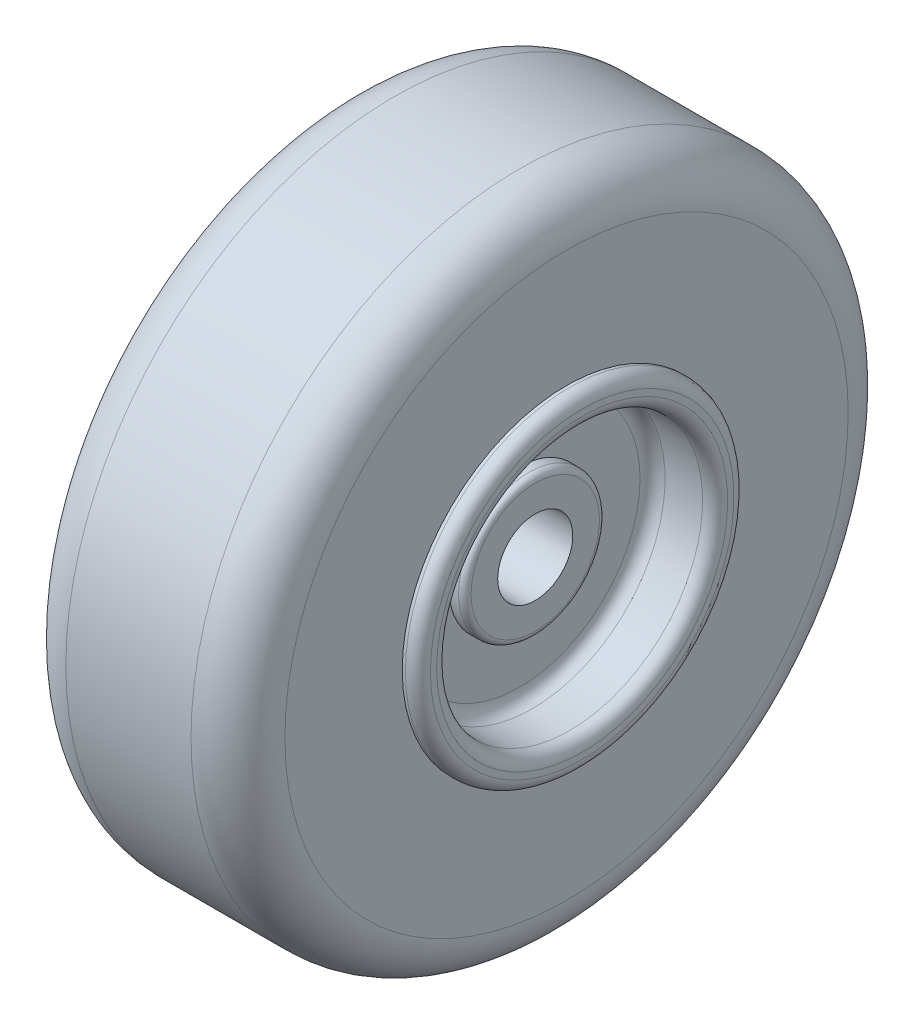
ISO-10303-21;
HEADER;
FILE_DESCRIPTION(('STEP AP214'),'2;1');
FILE_NAME('part.step','',(''),(''),'','','');
FILE_SCHEMA(('AUTOMOTIVE_DESIGN { 1 0 10303 214 1 1 1 1 }'));
ENDSEC;
DATA;
#1=APPLICATION_CONTEXT('core data for automotive mechanical design processes');
#2=APPLICATION_PROTOCOL_DEFINITION('international standard','automotive_design',2000,#1);
#3=PRODUCT_CONTEXT('',#1,'mechanical');
#4=PRODUCT('Part','Part','',(#3));
#5=PRODUCT_RELATED_PRODUCT_CATEGORY('part','',(#4));
#6=PRODUCT_DEFINITION_FORMATION('','',#4);
#7=PRODUCT_DEFINITION_CONTEXT('part definition',#1,'design');
#8=PRODUCT_DEFINITION('design','',#6,#7);
#9=PRODUCT_DEFINITION_SHAPE('','',#8);
#10=(LENGTH_UNIT() NAMED_UNIT(*) SI_UNIT(.MILLI.,.METRE.));
#11=(NAMED_UNIT(*) PLANE_ANGLE_UNIT() SI_UNIT($,.RADIAN.));
#12=(NAMED_UNIT(*) SI_UNIT($,.STERADIAN.) SOLID_ANGLE_UNIT());
#13=UNCERTAINTY_MEASURE_WITH_UNIT(LENGTH_MEASURE(1.E-05),#10,'distance_accuracy_value','');
#14=(GEOMETRIC_REPRESENTATION_CONTEXT(3) GLOBAL_UNCERTAINTY_ASSIGNED_CONTEXT((#13)) GLOBAL_UNIT_ASSIGNED_CONTEXT((#10,
#11,#12)) REPRESENTATION_CONTEXT('',''));
#15=CARTESIAN_POINT('',(0.,0.,0.));
#16=DIRECTION('',(0.,0.,1.));
#17=DIRECTION('',(1.,0.,0.));
#18=AXIS2_PLACEMENT_3D('',#15,#16,#17);
#19=CARTESIAN_POINT('',(2.4,0.,0.));
#20=DIRECTION('',(-1.,0.,0.));
#21=DIRECTION('',(0.,0.,1.));
#22=AXIS2_PLACEMENT_3D('',#19,#20,#21);
#23=TOROIDAL_SURFACE('',#22,3.85,0.4);
#24=CARTESIAN_POINT('',(2.4,0.,0.));
#25=DIRECTION('',(-1.,0.,0.));
#26=DIRECTION('',(0.,0.,1.));
#27=AXIS2_PLACEMENT_3D('',#24,#25,#26);
#28=CIRCLE('',#27,4.25);
#29=CARTESIAN_POINT('',(2.4,0.,4.25));
#30=VERTEX_POINT('',#29);
#31=EDGE_CURVE('E10',#30,#30,#28,.T.);
#32=ORIENTED_EDGE('',*,*,#31,.F.);
#33=EDGE_LOOP('',(#32));
#34=FACE_BOUND('',#33,.T.);
#35=CARTESIAN_POINT('',(2.,0.,0.));
#36=DIRECTION('',(-1.,0.,0.));
#37=DIRECTION('',(0.,0.,1.));
#38=AXIS2_PLACEMENT_3D('',#35,#36,#37);
#39=CIRCLE('',#38,3.85);
#40=CARTESIAN_POINT('',(2.,0.,3.85));
#41=VERTEX_POINT('',#40);
#42=EDGE_CURVE('E113',#41,#41,#39,.T.);
#43=ORIENTED_EDGE('',*,*,#42,.T.);
#44=EDGE_LOOP('',(#43));
#45=FACE_BOUND('',#44,.T.);
#46=ADVANCED_FACE('F31',(#34,#45),#23,.F.);
#47=CARTESIAN_POINT('',(0.,0.,0.));
#48=DIRECTION('',(-1.,0.,0.));
#49=DIRECTION('',(0.,0.,1.));
#50=AXIS2_PLACEMENT_3D('',#47,#48,#49);
#51=CYLINDRICAL_SURFACE('',#50,4.25);
#52=CARTESIAN_POINT('',(3.6,0.,0.));
#53=DIRECTION('',(-1.,0.,0.));
#54=DIRECTION('',(0.,0.,1.));
#55=AXIS2_PLACEMENT_3D('',#52,#53,#54);
#56=CIRCLE('',#55,4.25);
#57=CARTESIAN_POINT('',(3.6,0.,4.25));
#58=VERTEX_POINT('',#57);
#59=EDGE_CURVE('E37',#58,#58,#56,.T.);
#60=ORIENTED_EDGE('',*,*,#59,.F.);
#61=EDGE_LOOP('',(#60));
#62=FACE_BOUND('',#61,.T.);
#63=ORIENTED_EDGE('',*,*,#31,.T.);
#64=EDGE_LOOP('',(#63));
#65=FACE_BOUND('',#64,.T.);
#66=ADVANCED_FACE('F258',(#62,#65),#51,.F.);
#67=CARTESIAN_POINT('',(3.6,0.,0.));
#68=DIRECTION('',(-1.,0.,0.));
#69=DIRECTION('',(0.,0.,1.));
#70=AXIS2_PLACEMENT_3D('',#67,#68,#69);
#71=TOROIDAL_SURFACE('',#70,4.65,0.4);
#72=CARTESIAN_POINT('',(4.,0.,0.));
#73=DIRECTION('',(-1.,0.,0.));
#74=DIRECTION('',(0.,0.,1.));
#75=AXIS2_PLACEMENT_3D('',#72,#73,#74);
#76=CIRCLE('',#75,4.65);
#77=CARTESIAN_POINT('',(4.,0.,4.65));
#78=VERTEX_POINT('',#77);
#79=EDGE_CURVE('E41',#78,#78,#76,.T.);
#80=ORIENTED_EDGE('',*,*,#79,.F.);
#81=EDGE_LOOP('',(#80));
#82=FACE_BOUND('',#81,.T.);
#83=ORIENTED_EDGE('',*,*,#59,.T.);
#84=EDGE_LOOP('',(#83));
#85=FACE_BOUND('',#84,.T.);
#86=ADVANCED_FACE('F253',(#82,#85),#71,.T.);
#87=CARTESIAN_POINT('',(4.,4.85,0.));
#88=DIRECTION('',(-1.,0.,0.));
#89=DIRECTION('',(0.,0.,1.));
#90=AXIS2_PLACEMENT_3D('',#87,#88,#89);
#91=PLANE('',#90);
#92=CARTESIAN_POINT('',(4.,0.,0.));
#93=DIRECTION('',(-1.,0.,0.));
#94=DIRECTION('',(0.,0.,1.));
#95=AXIS2_PLACEMENT_3D('',#92,#93,#94);
#96=CIRCLE('',#95,4.85);
#97=CARTESIAN_POINT('',(4.,0.,4.85));
#98=VERTEX_POINT('',#97);
#99=EDGE_CURVE('E45',#98,#98,#96,.T.);
#100=ORIENTED_EDGE('',*,*,#99,.F.);
#101=EDGE_LOOP('',(#100));
#102=FACE_BOUND('',#101,.T.);
#103=ORIENTED_EDGE('',*,*,#79,.T.);
#104=EDGE_LOOP('',(#103));
#105=FACE_BOUND('',#104,.T.);
#106=ADVANCED_FACE('F247',(#102,#105),#91,.F.);
#107=CARTESIAN_POINT('',(3.6,0.,0.));
#108=DIRECTION('',(-1.,0.,0.));
#109=DIRECTION('',(0.,0.,1.));
#110=AXIS2_PLACEMENT_3D('',#107,#108,#109);
#111=TOROIDAL_SURFACE('',#110,4.85,0.4);
#112=CARTESIAN_POINT('',(3.6,0.,0.));
#113=DIRECTION('',(-1.,0.,0.));
#114=DIRECTION('',(0.,0.,1.));
#115=AXIS2_PLACEMENT_3D('',#112,#113,#114);
#116=CIRCLE('',#115,5.25);
#117=CARTESIAN_POINT('',(3.6,0.,5.25));
#118=VERTEX_POINT('',#117);
#119=EDGE_CURVE('E50',#118,#118,#116,.T.);
#120=ORIENTED_EDGE('',*,*,#119,.F.);
#121=EDGE_LOOP('',(#120));
#122=FACE_BOUND('',#121,.T.);
#123=ORIENTED_EDGE('',*,*,#99,.T.);
#124=EDGE_LOOP('',(#123));
#125=FACE_BOUND('',#124,.T.);
#126=ADVANCED_FACE('F241',(#122,#125),#111,.T.);
#127=CARTESIAN_POINT('',(0.,0.,0.));
#128=DIRECTION('',(-1.,0.,0.));
#129=DIRECTION('',(0.,0.,1.));
#130=AXIS2_PLACEMENT_3D('',#127,#128,#129);
#131=CYLINDRICAL_SURFACE('',#130,5.25);
#132=CARTESIAN_POINT('',(3.5,0.,0.));
#133=DIRECTION('',(-1.,0.,0.));
#134=DIRECTION('',(0.,0.,1.));
#135=AXIS2_PLACEMENT_3D('',#132,#133,#134);
#136=CIRCLE('',#135,5.25);
#137=CARTESIAN_POINT('',(3.5,0.,5.25));
#138=VERTEX_POINT('',#137);
#139=EDGE_CURVE('E53',#138,#138,#136,.T.);
#140=ORIENTED_EDGE('',*,*,#139,.F.);
#141=EDGE_LOOP('',(#140));
#142=FACE_BOUND('',#141,.T.);
#143=ORIENTED_EDGE('',*,*,#119,.T.);
#144=EDGE_LOOP('',(#143));
#145=FACE_BOUND('',#144,.T.);
#146=ADVANCED_FACE('F235',(#142,#145),#131,.T.);
#147=CARTESIAN_POINT('',(3.5,8.99999999999999,0.));
#148=DIRECTION('',(-1.,0.,0.));
#149=DIRECTION('',(0.,0.,1.));
#150=AXIS2_PLACEMENT_3D('',#147,#148,#149);
#151=PLANE('',#150);
#152=CARTESIAN_POINT('',(3.5,0.,0.));
#153=DIRECTION('',(-1.,0.,0.));
#154=DIRECTION('',(0.,0.,1.));
#155=AXIS2_PLACEMENT_3D('',#152,#153,#154);
#156=CIRCLE('',#155,8.99999999999999);
#157=CARTESIAN_POINT('',(3.5,0.,8.99999999999999));
#158=VERTEX_POINT('',#157);
#159=EDGE_CURVE('E56',#158,#158,#156,.T.);
#160=ORIENTED_EDGE('',*,*,#159,.F.);
#161=EDGE_LOOP('',(#160));
#162=FACE_BOUND('',#161,.T.);
#163=ORIENTED_EDGE('',*,*,#139,.T.);
#164=EDGE_LOOP('',(#163));
#165=FACE_BOUND('',#164,.T.);
#166=ADVANCED_FACE('F229',(#162,#165),#151,.F.);
#167=CARTESIAN_POINT('',(2.,0.,0.));
#168=DIRECTION('',(-1.,0.,0.));
#169=DIRECTION('',(0.,0.,1.));
#170=AXIS2_PLACEMENT_3D('',#167,#168,#169);
#171=TOROIDAL_SURFACE('',#170,9.,1.5);
#172=CARTESIAN_POINT('',(1.99999999999999,0.,0.));
#173=DIRECTION('',(-1.,0.,0.));
#174=DIRECTION('',(0.,0.,1.));
#175=AXIS2_PLACEMENT_3D('',#172,#173,#174);
#176=CIRCLE('',#175,10.5);
#177=CARTESIAN_POINT('',(1.99999999999999,0.,10.5));
#178=VERTEX_POINT('',#177);
#179=EDGE_CURVE('E59',#178,#178,#176,.T.);
#180=ORIENTED_EDGE('',*,*,#179,.F.);
#181=EDGE_LOOP('',(#180));
#182=FACE_BOUND('',#181,.T.);
#183=ORIENTED_EDGE('',*,*,#159,.T.);
#184=EDGE_LOOP('',(#183));
#185=FACE_BOUND('',#184,.T.);
#186=ADVANCED_FACE('F223',(#182,#185),#171,.T.);
#187=CARTESIAN_POINT('',(0.,0.,0.));
#188=DIRECTION('',(-1.,0.,0.));
#189=DIRECTION('',(0.,0.,1.));
#190=AXIS2_PLACEMENT_3D('',#187,#188,#189);
#191=CYLINDRICAL_SURFACE('',#190,10.5);
#192=CARTESIAN_POINT('',(-1.99999999999999,0.,0.));
#193=DIRECTION('',(-1.,0.,0.));
#194=DIRECTION('',(0.,0.,1.));
#195=AXIS2_PLACEMENT_3D('',#192,#193,#194);
#196=CIRCLE('',#195,10.5);
#197=CARTESIAN_POINT('',(-1.99999999999999,0.,10.5));
#198=VERTEX_POINT('',#197);
#199=EDGE_CURVE('E62',#198,#198,#196,.T.);
#200=ORIENTED_EDGE('',*,*,#199,.F.);
#201=EDGE_LOOP('',(#200));
#202=FACE_BOUND('',#201,.T.);
#203=ORIENTED_EDGE('',*,*,#179,.T.);
#204=EDGE_LOOP('',(#203));
#205=FACE_BOUND('',#204,.T.);
#206=ADVANCED_FACE('F217',(#202,#205),#191,.T.);
#207=CARTESIAN_POINT('',(-2.,0.,0.));
#208=DIRECTION('',(-1.,0.,0.));
#209=DIRECTION('',(0.,0.,1.));
#210=AXIS2_PLACEMENT_3D('',#207,#208,#209);
#211=TOROIDAL_SURFACE('',#210,9.,1.5);
#212=CARTESIAN_POINT('',(-3.5,0.,0.));
#213=DIRECTION('',(-1.,0.,0.));
#214=DIRECTION('',(0.,0.,1.));
#215=AXIS2_PLACEMENT_3D('',#212,#213,#214);
#216=CIRCLE('',#215,8.99999999999999);
#217=CARTESIAN_POINT('',(-3.5,0.,8.99999999999999));
#218=VERTEX_POINT('',#217);
#219=EDGE_CURVE('E65',#218,#218,#216,.T.);
#220=ORIENTED_EDGE('',*,*,#219,.F.);
#221=EDGE_LOOP('',(#220));
#222=FACE_BOUND('',#221,.T.);
#223=ORIENTED_EDGE('',*,*,#199,.T.);
#224=EDGE_LOOP('',(#223));
#225=FACE_BOUND('',#224,.T.);
#226=ADVANCED_FACE('F211',(#222,#225),#211,.T.);
#227=CARTESIAN_POINT('',(-3.5,8.99999999999999,0.));
#228=DIRECTION('',(1.,0.,0.));
#229=DIRECTION('',(0.,0.,-1.));
#230=AXIS2_PLACEMENT_3D('',#227,#228,#229);
#231=PLANE('',#230);
#232=CARTESIAN_POINT('',(-3.5,0.,0.));
#233=DIRECTION('',(-1.,0.,0.));
#234=DIRECTION('',(0.,0.,1.));
#235=AXIS2_PLACEMENT_3D('',#232,#233,#234);
#236=CIRCLE('',#235,5.25);
#237=CARTESIAN_POINT('',(-3.5,0.,5.25));
#238=VERTEX_POINT('',#237);
#239=EDGE_CURVE('E68',#238,#238,#236,.T.);
#240=ORIENTED_EDGE('',*,*,#239,.F.);
#241=EDGE_LOOP('',(#240));
#242=FACE_BOUND('',#241,.T.);
#243=ORIENTED_EDGE('',*,*,#219,.T.);
#244=EDGE_LOOP('',(#243));
#245=FACE_BOUND('',#244,.T.);
#246=ADVANCED_FACE('F205',(#242,#245),#231,.F.);
#247=CARTESIAN_POINT('',(0.,0.,0.));
#248=DIRECTION('',(-1.,0.,0.));
#249=DIRECTION('',(0.,0.,1.));
#250=AXIS2_PLACEMENT_3D('',#247,#248,#249);
#251=CYLINDRICAL_SURFACE('',#250,5.25);
#252=CARTESIAN_POINT('',(-3.6,0.,0.));
#253=DIRECTION('',(-1.,0.,0.));
#254=DIRECTION('',(0.,0.,1.));
#255=AXIS2_PLACEMENT_3D('',#252,#253,#254);
#256=CIRCLE('',#255,5.25);
#257=CARTESIAN_POINT('',(-3.6,0.,5.25));
#258=VERTEX_POINT('',#257);
#259=EDGE_CURVE('E71',#258,#258,#256,.T.);
#260=ORIENTED_EDGE('',*,*,#259,.F.);
#261=EDGE_LOOP('',(#260));
#262=FACE_BOUND('',#261,.T.);
#263=ORIENTED_EDGE('',*,*,#239,.T.);
#264=EDGE_LOOP('',(#263));
#265=FACE_BOUND('',#264,.T.);
#266=ADVANCED_FACE('F199',(#262,#265),#251,.T.);
#267=CARTESIAN_POINT('',(-3.6,0.,0.));
#268=DIRECTION('',(-1.,0.,0.));
#269=DIRECTION('',(0.,0.,1.));
#270=AXIS2_PLACEMENT_3D('',#267,#268,#269);
#271=TOROIDAL_SURFACE('',#270,4.85,0.4);
#272=CARTESIAN_POINT('',(-4.,0.,0.));
#273=DIRECTION('',(-1.,0.,0.));
#274=DIRECTION('',(0.,0.,1.));
#275=AXIS2_PLACEMENT_3D('',#272,#273,#274);
#276=CIRCLE('',#275,4.85);
#277=CARTESIAN_POINT('',(-4.,0.,4.85));
#278=VERTEX_POINT('',#277);
#279=EDGE_CURVE('E74',#278,#278,#276,.T.);
#280=ORIENTED_EDGE('',*,*,#279,.F.);
#281=EDGE_LOOP('',(#280));
#282=FACE_BOUND('',#281,.T.);
#283=ORIENTED_EDGE('',*,*,#259,.T.);
#284=EDGE_LOOP('',(#283));
#285=FACE_BOUND('',#284,.T.);
#286=ADVANCED_FACE('F193',(#282,#285),#271,.T.);
#287=CARTESIAN_POINT('',(-4.,4.85,0.));
#288=DIRECTION('',(1.,0.,0.));
#289=DIRECTION('',(0.,0.,-1.));
#290=AXIS2_PLACEMENT_3D('',#287,#288,#289);
#291=PLANE('',#290);
#292=CARTESIAN_POINT('',(-4.,0.,0.));
#293=DIRECTION('',(-1.,0.,0.));
#294=DIRECTION('',(0.,0.,1.));
#295=AXIS2_PLACEMENT_3D('',#292,#293,#294);
#296=CIRCLE('',#295,4.65);
#297=CARTESIAN_POINT('',(-4.,0.,4.65));
#298=VERTEX_POINT('',#297);
#299=EDGE_CURVE('E77',#298,#298,#296,.T.);
#300=ORIENTED_EDGE('',*,*,#299,.F.);
#301=EDGE_LOOP('',(#300));
#302=FACE_BOUND('',#301,.T.);
#303=ORIENTED_EDGE('',*,*,#279,.T.);
#304=EDGE_LOOP('',(#303));
#305=FACE_BOUND('',#304,.T.);
#306=ADVANCED_FACE('F187',(#302,#305),#291,.F.);
#307=CARTESIAN_POINT('',(-3.6,0.,0.));
#308=DIRECTION('',(-1.,0.,0.));
#309=DIRECTION('',(0.,0.,1.));
#310=AXIS2_PLACEMENT_3D('',#307,#308,#309);
#311=TOROIDAL_SURFACE('',#310,4.65,0.4);
#312=CARTESIAN_POINT('',(-3.6,0.,0.));
#313=DIRECTION('',(-1.,0.,0.));
#314=DIRECTION('',(0.,0.,1.));
#315=AXIS2_PLACEMENT_3D('',#312,#313,#314);
#316=CIRCLE('',#315,4.25);
#317=CARTESIAN_POINT('',(-3.6,0.,4.25));
#318=VERTEX_POINT('',#317);
#319=EDGE_CURVE('E80',#318,#318,#316,.T.);
#320=ORIENTED_EDGE('',*,*,#319,.F.);
#321=EDGE_LOOP('',(#320));
#322=FACE_BOUND('',#321,.T.);
#323=ORIENTED_EDGE('',*,*,#299,.T.);
#324=EDGE_LOOP('',(#323));
#325=FACE_BOUND('',#324,.T.);
#326=ADVANCED_FACE('F181',(#322,#325),#311,.T.);
#327=CARTESIAN_POINT('',(0.,0.,0.));
#328=DIRECTION('',(-1.,0.,0.));
#329=DIRECTION('',(0.,0.,1.));
#330=AXIS2_PLACEMENT_3D('',#327,#328,#329);
#331=CYLINDRICAL_SURFACE('',#330,4.25);
#332=CARTESIAN_POINT('',(-2.4,0.,0.));
#333=DIRECTION('',(-1.,0.,0.));
#334=DIRECTION('',(0.,0.,1.));
#335=AXIS2_PLACEMENT_3D('',#332,#333,#334);
#336=CIRCLE('',#335,4.25);
#337=CARTESIAN_POINT('',(-2.4,0.,4.25));
#338=VERTEX_POINT('',#337);
#339=EDGE_CURVE('E83',#338,#338,#336,.T.);
#340=ORIENTED_EDGE('',*,*,#339,.F.);
#341=EDGE_LOOP('',(#340));
#342=FACE_BOUND('',#341,.T.);
#343=ORIENTED_EDGE('',*,*,#319,.T.);
#344=EDGE_LOOP('',(#343));
#345=FACE_BOUND('',#344,.T.);
#346=ADVANCED_FACE('F175',(#342,#345),#331,.F.);
#347=CARTESIAN_POINT('',(-2.4,0.,0.));
#348=DIRECTION('',(-1.,0.,0.));
#349=DIRECTION('',(0.,0.,1.));
#350=AXIS2_PLACEMENT_3D('',#347,#348,#349);
#351=TOROIDAL_SURFACE('',#350,3.85,0.4);
#352=CARTESIAN_POINT('',(-2.,0.,0.));
#353=DIRECTION('',(-1.,0.,0.));
#354=DIRECTION('',(0.,0.,1.));
#355=AXIS2_PLACEMENT_3D('',#352,#353,#354);
#356=CIRCLE('',#355,3.85);
#357=CARTESIAN_POINT('',(-2.,0.,3.85));
#358=VERTEX_POINT('',#357);
#359=EDGE_CURVE('E86',#358,#358,#356,.T.);
#360=ORIENTED_EDGE('',*,*,#359,.F.);
#361=EDGE_LOOP('',(#360));
#362=FACE_BOUND('',#361,.T.);
#363=ORIENTED_EDGE('',*,*,#339,.T.);
#364=EDGE_LOOP('',(#363));
#365=FACE_BOUND('',#364,.T.);
#366=ADVANCED_FACE('F169',(#362,#365),#351,.F.);
#367=CARTESIAN_POINT('',(-2.,3.85,0.));
#368=DIRECTION('',(1.,0.,0.));
#369=DIRECTION('',(0.,0.,-1.));
#370=AXIS2_PLACEMENT_3D('',#367,#368,#369);
#371=PLANE('',#370);
#372=CARTESIAN_POINT('',(-2.,0.,0.));
#373=DIRECTION('',(-1.,0.,0.));
#374=DIRECTION('',(0.,0.,1.));
#375=AXIS2_PLACEMENT_3D('',#372,#373,#374);
#376=CIRCLE('',#375,2.25);
#377=CARTESIAN_POINT('',(-2.,0.,2.25));
#378=VERTEX_POINT('',#377);
#379=EDGE_CURVE('E89',#378,#378,#376,.T.);
#380=ORIENTED_EDGE('',*,*,#379,.F.);
#381=EDGE_LOOP('',(#380));
#382=FACE_BOUND('',#381,.T.);
#383=ORIENTED_EDGE('',*,*,#359,.T.);
#384=EDGE_LOOP('',(#383));
#385=FACE_BOUND('',#384,.T.);
#386=ADVANCED_FACE('F163',(#382,#385),#371,.F.);
#387=CARTESIAN_POINT('',(0.,0.,0.));
#388=DIRECTION('',(-1.,0.,0.));
#389=DIRECTION('',(0.,0.,1.));
#390=AXIS2_PLACEMENT_3D('',#387,#388,#389);
#391=CYLINDRICAL_SURFACE('',#390,2.25);
#392=CARTESIAN_POINT('',(-2.3,0.,0.));
#393=DIRECTION('',(-1.,0.,0.));
#394=DIRECTION('',(0.,0.,1.));
#395=AXIS2_PLACEMENT_3D('',#392,#393,#394);
#396=CIRCLE('',#395,2.25);
#397=CARTESIAN_POINT('',(-2.3,0.,2.25));
#398=VERTEX_POINT('',#397);
#399=EDGE_CURVE('E92',#398,#398,#396,.T.);
#400=ORIENTED_EDGE('',*,*,#399,.F.);
#401=EDGE_LOOP('',(#400));
#402=FACE_BOUND('',#401,.T.);
#403=ORIENTED_EDGE('',*,*,#379,.T.);
#404=EDGE_LOOP('',(#403));
#405=FACE_BOUND('',#404,.T.);
#406=ADVANCED_FACE('F157',(#402,#405),#391,.T.);
#407=CARTESIAN_POINT('',(-2.3,0.,0.));
#408=DIRECTION('',(-1.,0.,0.));
#409=DIRECTION('',(0.,0.,1.));
#410=AXIS2_PLACEMENT_3D('',#407,#408,#409);
#411=TOROIDAL_SURFACE('',#410,2.05,0.2);
#412=CARTESIAN_POINT('',(-2.5,0.,0.));
#413=DIRECTION('',(-1.,0.,0.));
#414=DIRECTION('',(0.,0.,1.));
#415=AXIS2_PLACEMENT_3D('',#412,#413,#414);
#416=CIRCLE('',#415,2.05);
#417=CARTESIAN_POINT('',(-2.5,0.,2.05));
#418=VERTEX_POINT('',#417);
#419=EDGE_CURVE('E95',#418,#418,#416,.T.);
#420=ORIENTED_EDGE('',*,*,#419,.F.);
#421=EDGE_LOOP('',(#420));
#422=FACE_BOUND('',#421,.T.);
#423=ORIENTED_EDGE('',*,*,#399,.T.);
#424=EDGE_LOOP('',(#423));
#425=FACE_BOUND('',#424,.T.);
#426=ADVANCED_FACE('F151',(#422,#425),#411,.T.);
#427=CARTESIAN_POINT('',(-2.5,1.2,0.));
#428=DIRECTION('',(1.,0.,0.));
#429=DIRECTION('',(0.,0.,-1.));
#430=AXIS2_PLACEMENT_3D('',#427,#428,#429);
#431=PLANE('',#430);
#432=CARTESIAN_POINT('',(-2.5,0.,0.));
#433=DIRECTION('',(-1.,0.,0.));
#434=DIRECTION('',(0.,0.,1.));
#435=AXIS2_PLACEMENT_3D('',#432,#433,#434);
#436=CIRCLE('',#435,1.2);
#437=CARTESIAN_POINT('',(-2.5,0.,1.2));
#438=VERTEX_POINT('',#437);
#439=EDGE_CURVE('E98',#438,#438,#436,.T.);
#440=ORIENTED_EDGE('',*,*,#439,.F.);
#441=EDGE_LOOP('',(#440));
#442=FACE_BOUND('',#441,.T.);
#443=ORIENTED_EDGE('',*,*,#419,.T.);
#444=EDGE_LOOP('',(#443));
#445=FACE_BOUND('',#444,.T.);
#446=ADVANCED_FACE('F145',(#442,#445),#431,.F.);
#447=CARTESIAN_POINT('',(0.,0.,0.));
#448=DIRECTION('',(-1.,0.,0.));
#449=DIRECTION('',(0.,0.,1.));
#450=AXIS2_PLACEMENT_3D('',#447,#448,#449);
#451=CYLINDRICAL_SURFACE('',#450,1.2);
#452=CARTESIAN_POINT('',(2.5,0.,0.));
#453=DIRECTION('',(-1.,0.,0.));
#454=DIRECTION('',(0.,0.,1.));
#455=AXIS2_PLACEMENT_3D('',#452,#453,#454);
#456=CIRCLE('',#455,1.2);
#457=CARTESIAN_POINT('',(2.5,0.,1.2));
#458=VERTEX_POINT('',#457);
#459=EDGE_CURVE('E101',#458,#458,#456,.T.);
#460=ORIENTED_EDGE('',*,*,#459,.F.);
#461=EDGE_LOOP('',(#460));
#462=FACE_BOUND('',#461,.T.);
#463=ORIENTED_EDGE('',*,*,#439,.T.);
#464=EDGE_LOOP('',(#463));
#465=FACE_BOUND('',#464,.T.);
#466=ADVANCED_FACE('F139',(#462,#465),#451,.F.);
#467=CARTESIAN_POINT('',(2.5,1.2,0.));
#468=DIRECTION('',(-1.,0.,0.));
#469=DIRECTION('',(0.,0.,1.));
#470=AXIS2_PLACEMENT_3D('',#467,#468,#469);
#471=PLANE('',#470);
#472=CARTESIAN_POINT('',(2.5,0.,0.));
#473=DIRECTION('',(-1.,0.,0.));
#474=DIRECTION('',(0.,0.,1.));
#475=AXIS2_PLACEMENT_3D('',#472,#473,#474);
#476=CIRCLE('',#475,2.05);
#477=CARTESIAN_POINT('',(2.5,0.,2.05));
#478=VERTEX_POINT('',#477);
#479=EDGE_CURVE('E104',#478,#478,#476,.T.);
#480=ORIENTED_EDGE('',*,*,#479,.F.);
#481=EDGE_LOOP('',(#480));
#482=FACE_BOUND('',#481,.T.);
#483=ORIENTED_EDGE('',*,*,#459,.T.);
#484=EDGE_LOOP('',(#483));
#485=FACE_BOUND('',#484,.T.);
#486=ADVANCED_FACE('F133',(#482,#485),#471,.F.);
#487=CARTESIAN_POINT('',(2.3,0.,0.));
#488=DIRECTION('',(-1.,0.,0.));
#489=DIRECTION('',(0.,0.,1.));
#490=AXIS2_PLACEMENT_3D('',#487,#488,#489);
#491=TOROIDAL_SURFACE('',#490,2.05,0.2);
#492=CARTESIAN_POINT('',(2.3,0.,0.));
#493=DIRECTION('',(-1.,0.,0.));
#494=DIRECTION('',(0.,0.,1.));
#495=AXIS2_PLACEMENT_3D('',#492,#493,#494);
#496=CIRCLE('',#495,2.25);
#497=CARTESIAN_POINT('',(2.3,0.,2.25));
#498=VERTEX_POINT('',#497);
#499=EDGE_CURVE('E107',#498,#498,#496,.T.);
#500=ORIENTED_EDGE('',*,*,#499,.F.);
#501=EDGE_LOOP('',(#500));
#502=FACE_BOUND('',#501,.T.);
#503=ORIENTED_EDGE('',*,*,#479,.T.);
#504=EDGE_LOOP('',(#503));
#505=FACE_BOUND('',#504,.T.);
#506=ADVANCED_FACE('F127',(#502,#505),#491,.T.);
#507=CARTESIAN_POINT('',(0.,0.,0.));
#508=DIRECTION('',(-1.,0.,0.));
#509=DIRECTION('',(0.,0.,1.));
#510=AXIS2_PLACEMENT_3D('',#507,#508,#509);
#511=CYLINDRICAL_SURFACE('',#510,2.25);
#512=CARTESIAN_POINT('',(2.,0.,0.));
#513=DIRECTION('',(-1.,0.,0.));
#514=DIRECTION('',(0.,0.,1.));
#515=AXIS2_PLACEMENT_3D('',#512,#513,#514);
#516=CIRCLE('',#515,2.25);
#517=CARTESIAN_POINT('',(2.,0.,2.25));
#518=VERTEX_POINT('',#517);
#519=EDGE_CURVE('E110',#518,#518,#516,.T.);
#520=ORIENTED_EDGE('',*,*,#519,.F.);
#521=EDGE_LOOP('',(#520));
#522=FACE_BOUND('',#521,.T.);
#523=ORIENTED_EDGE('',*,*,#499,.T.);
#524=EDGE_LOOP('',(#523));
#525=FACE_BOUND('',#524,.T.);
#526=ADVANCED_FACE('F121',(#522,#525),#511,.T.);
#527=CARTESIAN_POINT('',(2.,3.85,0.));
#528=DIRECTION('',(-1.,0.,0.));
#529=DIRECTION('',(0.,0.,1.));
#530=AXIS2_PLACEMENT_3D('',#527,#528,#529);
#531=PLANE('',#530);
#532=ORIENTED_EDGE('',*,*,#42,.F.);
#533=EDGE_LOOP('',(#532));
#534=FACE_BOUND('',#533,.T.);
#535=ORIENTED_EDGE('',*,*,#519,.T.);
#536=EDGE_LOOP('',(#535));
#537=FACE_BOUND('',#536,.T.);
#538=ADVANCED_FACE('F118',(#534,#537),#531,.F.);
#539=CLOSED_SHELL('',(#46,#66,#86,#106,#126,#146,#166,#186,#206,#226,#246,#266,#286,#306,#326,
#346,#366,#386,#406,#426,#446,#466,#486,#506,#526,#538));
#540=MANIFOLD_SOLID_BREP('B2',#539);
#541=ADVANCED_BREP_SHAPE_REPRESENTATION('',(#18,#540),#14);
#542=SHAPE_DEFINITION_REPRESENTATION(#9,#541);
ENDSEC;
END-ISO-10303-21;
